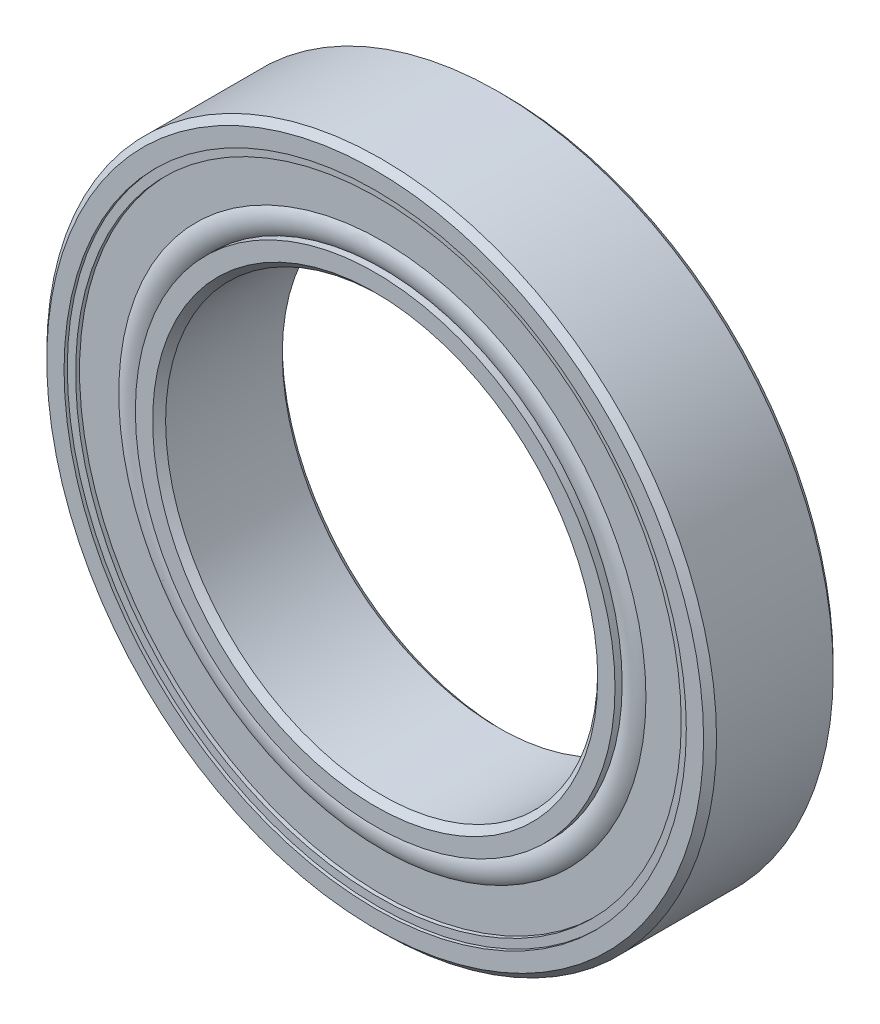
ISO-10303-21;
HEADER;
FILE_DESCRIPTION(('STEP AP214'),'2;1');
FILE_NAME('part.step','',(''),(''),'','','');
FILE_SCHEMA(('AUTOMOTIVE_DESIGN { 1 0 10303 214 1 1 1 1 }'));
ENDSEC;
DATA;
#1=APPLICATION_CONTEXT('core data for automotive mechanical design processes');
#2=APPLICATION_PROTOCOL_DEFINITION('international standard','automotive_design',2000,#1);
#3=PRODUCT_CONTEXT('',#1,'mechanical');
#4=PRODUCT('Part','Part','',(#3));
#5=PRODUCT_RELATED_PRODUCT_CATEGORY('part','',(#4));
#6=PRODUCT_DEFINITION_FORMATION('','',#4);
#7=PRODUCT_DEFINITION_CONTEXT('part definition',#1,'design');
#8=PRODUCT_DEFINITION('design','',#6,#7);
#9=PRODUCT_DEFINITION_SHAPE('','',#8);
#10=(LENGTH_UNIT() NAMED_UNIT(*) SI_UNIT(.MILLI.,.METRE.));
#11=(NAMED_UNIT(*) PLANE_ANGLE_UNIT() SI_UNIT($,.RADIAN.));
#12=(NAMED_UNIT(*) SI_UNIT($,.STERADIAN.) SOLID_ANGLE_UNIT());
#13=UNCERTAINTY_MEASURE_WITH_UNIT(LENGTH_MEASURE(1.E-05),#10,'distance_accuracy_value','');
#14=(GEOMETRIC_REPRESENTATION_CONTEXT(3) GLOBAL_UNCERTAINTY_ASSIGNED_CONTEXT((#13)) GLOBAL_UNIT_ASSIGNED_CONTEXT((#10,
#11,#12)) REPRESENTATION_CONTEXT('',''));
#15=CARTESIAN_POINT('',(0.,0.,0.));
#16=DIRECTION('',(0.,0.,1.));
#17=DIRECTION('',(1.,0.,0.));
#18=AXIS2_PLACEMENT_3D('',#15,#16,#17);
#19=CARTESIAN_POINT('',(0.,0.,-3.8571595971106));
#20=DIRECTION('',(0.,0.,1.));
#21=DIRECTION('',(1.,0.,0.));
#22=AXIS2_PLACEMENT_3D('',#19,#20,#21);
#23=TOROIDAL_SURFACE('',#22,23.29975,1.8428404028894);
#24=CARTESIAN_POINT('',(0.,0.,-5.3356929076997));
#25=DIRECTION('',(0.,0.,1.));
#26=DIRECTION('',(1.,0.,0.));
#27=AXIS2_PLACEMENT_3D('',#24,#25,#26);
#28=CIRCLE('',#27,24.39975);
#29=CARTESIAN_POINT('',(24.39975,0.,-5.3356929076997));
#30=VERTEX_POINT('',#29);
#31=EDGE_CURVE('E11',#30,#30,#28,.T.);
#32=ORIENTED_EDGE('',*,*,#31,.F.);
#33=EDGE_LOOP('',(#32));
#34=FACE_BOUND('',#33,.T.);
#35=CARTESIAN_POINT('',(0.,0.,-5.3356929076997));
#36=DIRECTION('',(0.,0.,1.));
#37=DIRECTION('',(1.,0.,0.));
#38=AXIS2_PLACEMENT_3D('',#35,#36,#37);
#39=CIRCLE('',#38,22.19975);
#40=CARTESIAN_POINT('',(22.19975,0.,-5.3356929076997));
#41=VERTEX_POINT('',#40);
#42=EDGE_CURVE('E73',#41,#41,#39,.T.);
#43=ORIENTED_EDGE('',*,*,#42,.T.);
#44=EDGE_LOOP('',(#43));
#45=FACE_BOUND('',#44,.T.);
#46=ADVANCED_FACE('F48',(#34,#45),#23,.T.);
#47=CARTESIAN_POINT('',(0.,28.02975,-5.3356929076997));
#48=DIRECTION('',(0.,0.,1.));
#49=DIRECTION('',(1.,0.,0.));
#50=AXIS2_PLACEMENT_3D('',#47,#48,#49);
#51=PLANE('',#50);
#52=CARTESIAN_POINT('',(0.,0.,-5.3356929076997));
#53=DIRECTION('',(0.,0.,1.));
#54=DIRECTION('',(1.,0.,0.));
#55=AXIS2_PLACEMENT_3D('',#52,#53,#54);
#56=CIRCLE('',#55,28.02975);
#57=CARTESIAN_POINT('',(28.02975,0.,-5.3356929076997));
#58=VERTEX_POINT('',#57);
#59=EDGE_CURVE('E54',#58,#58,#56,.T.);
#60=ORIENTED_EDGE('',*,*,#59,.F.);
#61=EDGE_LOOP('',(#60));
#62=FACE_BOUND('',#61,.T.);
#63=ORIENTED_EDGE('',*,*,#31,.T.);
#64=EDGE_LOOP('',(#63));
#65=FACE_BOUND('',#64,.T.);
#66=ADVANCED_FACE('F104',(#62,#65),#51,.F.);
#67=CARTESIAN_POINT('',(0.,0.,6.));
#68=DIRECTION('',(0.,0.,1.));
#69=DIRECTION('',(1.,0.,0.));
#70=AXIS2_PLACEMENT_3D('',#67,#68,#69);
#71=CYLINDRICAL_SURFACE('',#70,28.02975);
#72=CARTESIAN_POINT('',(0.,0.,-5.7));
#73=DIRECTION('',(0.,0.,1.));
#74=DIRECTION('',(1.,0.,0.));
#75=AXIS2_PLACEMENT_3D('',#72,#73,#74);
#76=CIRCLE('',#75,28.02975);
#77=CARTESIAN_POINT('',(28.02975,0.,-5.7));
#78=VERTEX_POINT('',#77);
#79=EDGE_CURVE('E58',#78,#78,#76,.T.);
#80=ORIENTED_EDGE('',*,*,#79,.F.);
#81=EDGE_LOOP('',(#80));
#82=FACE_BOUND('',#81,.T.);
#83=ORIENTED_EDGE('',*,*,#59,.T.);
#84=EDGE_LOOP('',(#83));
#85=FACE_BOUND('',#84,.T.);
#86=ADVANCED_FACE('F99',(#82,#85),#71,.F.);
#87=CARTESIAN_POINT('',(0.,28.79975,-5.7));
#88=DIRECTION('',(0.,0.,1.));
#89=DIRECTION('',(1.,0.,0.));
#90=AXIS2_PLACEMENT_3D('',#87,#88,#89);
#91=PLANE('',#90);
#92=CARTESIAN_POINT('',(0.,0.,-5.7));
#93=DIRECTION('',(0.,0.,1.));
#94=DIRECTION('',(1.,0.,0.));
#95=AXIS2_PLACEMENT_3D('',#92,#93,#94);
#96=CIRCLE('',#95,28.79975);
#97=CARTESIAN_POINT('',(28.79975,0.,-5.7));
#98=VERTEX_POINT('',#97);
#99=EDGE_CURVE('E62',#98,#98,#96,.T.);
#100=ORIENTED_EDGE('',*,*,#99,.F.);
#101=EDGE_LOOP('',(#100));
#102=FACE_BOUND('',#101,.T.);
#103=ORIENTED_EDGE('',*,*,#79,.T.);
#104=EDGE_LOOP('',(#103));
#105=FACE_BOUND('',#104,.T.);
#106=ADVANCED_FACE('F93',(#102,#105),#91,.F.);
#107=CARTESIAN_POINT('',(0.,0.,6.));
#108=DIRECTION('',(0.,0.,1.));
#109=DIRECTION('',(1.,0.,0.));
#110=AXIS2_PLACEMENT_3D('',#107,#108,#109);
#111=CYLINDRICAL_SURFACE('',#110,28.79975);
#112=CARTESIAN_POINT('',(0.,0.,-4.24277163079879));
#113=DIRECTION('',(0.,0.,1.));
#114=DIRECTION('',(1.,0.,0.));
#115=AXIS2_PLACEMENT_3D('',#112,#113,#114);
#116=CIRCLE('',#115,28.79975);
#117=CARTESIAN_POINT('',(28.79975,0.,-4.24277163079879));
#118=VERTEX_POINT('',#117);
#119=EDGE_CURVE('E67',#118,#118,#116,.T.);
#120=ORIENTED_EDGE('',*,*,#119,.F.);
#121=EDGE_LOOP('',(#120));
#122=FACE_BOUND('',#121,.T.);
#123=ORIENTED_EDGE('',*,*,#99,.T.);
#124=EDGE_LOOP('',(#123));
#125=FACE_BOUND('',#124,.T.);
#126=ADVANCED_FACE('F87',(#122,#125),#111,.T.);
#127=CARTESIAN_POINT('',(0.,28.79975,-4.24277163079879));
#128=DIRECTION('',(0.,0.,-1.));
#129=DIRECTION('',(-1.,0.,0.));
#130=AXIS2_PLACEMENT_3D('',#127,#128,#129);
#131=PLANE('',#130);
#132=CARTESIAN_POINT('',(0.,0.,-4.2427716307988));
#133=DIRECTION('',(0.,0.,1.));
#134=DIRECTION('',(1.,0.,0.));
#135=AXIS2_PLACEMENT_3D('',#132,#133,#134);
#136=CIRCLE('',#135,22.19975);
#137=CARTESIAN_POINT('',(22.19975,0.,-4.2427716307988));
#138=VERTEX_POINT('',#137);
#139=EDGE_CURVE('E70',#138,#138,#136,.T.);
#140=ORIENTED_EDGE('',*,*,#139,.F.);
#141=EDGE_LOOP('',(#140));
#142=FACE_BOUND('',#141,.T.);
#143=ORIENTED_EDGE('',*,*,#119,.T.);
#144=EDGE_LOOP('',(#143));
#145=FACE_BOUND('',#144,.T.);
#146=ADVANCED_FACE('F81',(#142,#145),#131,.F.);
#147=CARTESIAN_POINT('',(0.,0.,6.));
#148=DIRECTION('',(0.,0.,1.));
#149=DIRECTION('',(1.,0.,0.));
#150=AXIS2_PLACEMENT_3D('',#147,#148,#149);
#151=CYLINDRICAL_SURFACE('',#150,22.19975);
#152=ORIENTED_EDGE('',*,*,#42,.F.);
#153=EDGE_LOOP('',(#152));
#154=FACE_BOUND('',#153,.T.);
#155=ORIENTED_EDGE('',*,*,#139,.T.);
#156=EDGE_LOOP('',(#155));
#157=FACE_BOUND('',#156,.T.);
#158=ADVANCED_FACE('F78',(#154,#157),#151,.F.);
#159=CLOSED_SHELL('',(#46,#66,#86,#106,#126,#146,#158));
#160=MANIFOLD_SOLID_BREP('B2',#159);
#161=CARTESIAN_POINT('',(0.,28.79975,5.7));
#162=DIRECTION('',(0.,0.,-1.));
#163=DIRECTION('',(-1.,0.,0.));
#164=AXIS2_PLACEMENT_3D('',#161,#162,#163);
#165=PLANE('',#164);
#166=CARTESIAN_POINT('',(0.,0.,5.7));
#167=DIRECTION('',(0.,0.,1.));
#168=DIRECTION('',(1.,0.,0.));
#169=AXIS2_PLACEMENT_3D('',#166,#167,#168);
#170=CIRCLE('',#169,28.02975);
#171=CARTESIAN_POINT('',(28.02975,0.,5.7));
#172=VERTEX_POINT('',#171);
#173=EDGE_CURVE('E172',#172,#172,#170,.T.);
#174=ORIENTED_EDGE('',*,*,#173,.F.);
#175=EDGE_LOOP('',(#174));
#176=FACE_BOUND('',#175,.T.);
#177=CARTESIAN_POINT('',(0.,0.,5.7));
#178=DIRECTION('',(0.,0.,1.));
#179=DIRECTION('',(1.,0.,0.));
#180=AXIS2_PLACEMENT_3D('',#177,#178,#179);
#181=CIRCLE('',#180,28.79975);
#182=CARTESIAN_POINT('',(28.79975,0.,5.7));
#183=VERTEX_POINT('',#182);
#184=EDGE_CURVE('E47',#183,#183,#181,.T.);
#185=ORIENTED_EDGE('',*,*,#184,.T.);
#186=EDGE_LOOP('',(#185));
#187=FACE_BOUND('',#186,.T.);
#188=ADVANCED_FACE('F147',(#176,#187),#165,.F.);
#189=CARTESIAN_POINT('',(0.,0.,6.));
#190=DIRECTION('',(0.,0.,1.));
#191=DIRECTION('',(1.,0.,0.));
#192=AXIS2_PLACEMENT_3D('',#189,#190,#191);
#193=CYLINDRICAL_SURFACE('',#192,28.79975);
#194=ORIENTED_EDGE('',*,*,#184,.F.);
#195=EDGE_LOOP('',(#194));
#196=FACE_BOUND('',#195,.T.);
#197=CARTESIAN_POINT('',(0.,0.,4.2427716307988));
#198=DIRECTION('',(0.,0.,1.));
#199=DIRECTION('',(1.,0.,0.));
#200=AXIS2_PLACEMENT_3D('',#197,#198,#199);
#201=CIRCLE('',#200,28.79975);
#202=CARTESIAN_POINT('',(28.79975,0.,4.2427716307988));
#203=VERTEX_POINT('',#202);
#204=EDGE_CURVE('E153',#203,#203,#201,.T.);
#205=ORIENTED_EDGE('',*,*,#204,.T.);
#206=EDGE_LOOP('',(#205));
#207=FACE_BOUND('',#206,.T.);
#208=ADVANCED_FACE('F179',(#196,#207),#193,.T.);
#209=CARTESIAN_POINT('',(0.,28.79975,4.2427716307988));
#210=DIRECTION('',(0.,0.,1.));
#211=DIRECTION('',(1.,0.,0.));
#212=AXIS2_PLACEMENT_3D('',#209,#210,#211);
#213=PLANE('',#212);
#214=ORIENTED_EDGE('',*,*,#204,.F.);
#215=EDGE_LOOP('',(#214));
#216=FACE_BOUND('',#215,.T.);
#217=CARTESIAN_POINT('',(0.,0.,4.2427716307988));
#218=DIRECTION('',(0.,0.,1.));
#219=DIRECTION('',(1.,0.,0.));
#220=AXIS2_PLACEMENT_3D('',#217,#218,#219);
#221=CIRCLE('',#220,22.19975);
#222=CARTESIAN_POINT('',(22.19975,0.,4.2427716307988));
#223=VERTEX_POINT('',#222);
#224=EDGE_CURVE('E157',#223,#223,#221,.T.);
#225=ORIENTED_EDGE('',*,*,#224,.T.);
#226=EDGE_LOOP('',(#225));
#227=FACE_BOUND('',#226,.T.);
#228=ADVANCED_FACE('F183',(#216,#227),#213,.F.);
#229=CARTESIAN_POINT('',(0.,0.,6.));
#230=DIRECTION('',(0.,0.,1.));
#231=DIRECTION('',(1.,0.,0.));
#232=AXIS2_PLACEMENT_3D('',#229,#230,#231);
#233=CYLINDRICAL_SURFACE('',#232,22.19975);
#234=ORIENTED_EDGE('',*,*,#224,.F.);
#235=EDGE_LOOP('',(#234));
#236=FACE_BOUND('',#235,.T.);
#237=CARTESIAN_POINT('',(0.,0.,5.3356929076997));
#238=DIRECTION('',(0.,0.,1.));
#239=DIRECTION('',(1.,0.,0.));
#240=AXIS2_PLACEMENT_3D('',#237,#238,#239);
#241=CIRCLE('',#240,22.19975);
#242=CARTESIAN_POINT('',(22.19975,0.,5.3356929076997));
#243=VERTEX_POINT('',#242);
#244=EDGE_CURVE('E161',#243,#243,#241,.T.);
#245=ORIENTED_EDGE('',*,*,#244,.T.);
#246=EDGE_LOOP('',(#245));
#247=FACE_BOUND('',#246,.T.);
#248=ADVANCED_FACE('F188',(#236,#247),#233,.F.);
#249=CARTESIAN_POINT('',(0.,0.,3.8571595971106));
#250=DIRECTION('',(0.,0.,1.));
#251=DIRECTION('',(1.,0.,0.));
#252=AXIS2_PLACEMENT_3D('',#249,#250,#251);
#253=TOROIDAL_SURFACE('',#252,23.29975,1.8428404028894);
#254=ORIENTED_EDGE('',*,*,#244,.F.);
#255=EDGE_LOOP('',(#254));
#256=FACE_BOUND('',#255,.T.);
#257=CARTESIAN_POINT('',(0.,0.,5.3356929076997));
#258=DIRECTION('',(0.,0.,1.));
#259=DIRECTION('',(1.,0.,0.));
#260=AXIS2_PLACEMENT_3D('',#257,#258,#259);
#261=CIRCLE('',#260,24.39975);
#262=CARTESIAN_POINT('',(24.39975,0.,5.3356929076997));
#263=VERTEX_POINT('',#262);
#264=EDGE_CURVE('E166',#263,#263,#261,.T.);
#265=ORIENTED_EDGE('',*,*,#264,.T.);
#266=EDGE_LOOP('',(#265));
#267=FACE_BOUND('',#266,.T.);
#268=ADVANCED_FACE('F194',(#256,#267),#253,.T.);
#269=CARTESIAN_POINT('',(0.,28.02975,5.3356929076997));
#270=DIRECTION('',(0.,0.,-1.));
#271=DIRECTION('',(-1.,0.,0.));
#272=AXIS2_PLACEMENT_3D('',#269,#270,#271);
#273=PLANE('',#272);
#274=ORIENTED_EDGE('',*,*,#264,.F.);
#275=EDGE_LOOP('',(#274));
#276=FACE_BOUND('',#275,.T.);
#277=CARTESIAN_POINT('',(0.,0.,5.3356929076997));
#278=DIRECTION('',(0.,0.,1.));
#279=DIRECTION('',(1.,0.,0.));
#280=AXIS2_PLACEMENT_3D('',#277,#278,#279);
#281=CIRCLE('',#280,28.02975);
#282=CARTESIAN_POINT('',(28.02975,0.,5.3356929076997));
#283=VERTEX_POINT('',#282);
#284=EDGE_CURVE('E169',#283,#283,#281,.T.);
#285=ORIENTED_EDGE('',*,*,#284,.T.);
#286=EDGE_LOOP('',(#285));
#287=FACE_BOUND('',#286,.T.);
#288=ADVANCED_FACE('F198',(#276,#287),#273,.F.);
#289=CARTESIAN_POINT('',(0.,0.,6.));
#290=DIRECTION('',(0.,0.,1.));
#291=DIRECTION('',(1.,0.,0.));
#292=AXIS2_PLACEMENT_3D('',#289,#290,#291);
#293=CYLINDRICAL_SURFACE('',#292,28.02975);
#294=ORIENTED_EDGE('',*,*,#284,.F.);
#295=EDGE_LOOP('',(#294));
#296=FACE_BOUND('',#295,.T.);
#297=ORIENTED_EDGE('',*,*,#173,.T.);
#298=EDGE_LOOP('',(#297));
#299=FACE_BOUND('',#298,.T.);
#300=ADVANCED_FACE('F176',(#296,#299),#293,.F.);
#301=CLOSED_SHELL('',(#188,#208,#228,#248,#268,#288,#300));
#302=MANIFOLD_SOLID_BREP('B6',#301);
#303=CARTESIAN_POINT('',(-13.7862056849131,21.4517547738121,0.));
#304=DIRECTION('',(0.,0.,1.));
#305=DIRECTION('',(-0.540640817455586,0.841253532831188,0.));
#306=AXIS2_PLACEMENT_3D('',#303,#304,#305);
#307=SPHERICAL_SURFACE('',#306,4.2427716307988);
#308=CARTESIAN_POINT('',(-13.7862056849131,21.4517547738121,4.2427716307988));
#309=VERTEX_POINT('',#308);
#310=VERTEX_LOOP('',#309);
#311=FACE_BOUND('',#310,.T.);
#312=ADVANCED_FACE('F246',(#311),#307,.T.);
#313=CLOSED_SHELL('',(#312));
#314=MANIFOLD_SOLID_BREP('B42',#313);
#315=CARTESIAN_POINT('',(-23.1953884735413,10.5929789777951,0.));
#316=DIRECTION('',(0.,0.,1.));
#317=DIRECTION('',(-0.909631995354513,0.415415013001897,0.));
#318=AXIS2_PLACEMENT_3D('',#315,#316,#317);
#319=SPHERICAL_SURFACE('',#318,4.2427716307988);
#320=CARTESIAN_POINT('',(-23.1953884735413,10.5929789777951,4.2427716307988));
#321=VERTEX_POINT('',#320);
#322=VERTEX_LOOP('',#321);
#323=FACE_BOUND('',#322,.T.);
#324=ADVANCED_FACE('F263',(#323),#319,.T.);
#325=CLOSED_SHELL('',(#324));
#326=MANIFOLD_SOLID_BREP('B143',#325);
#327=CARTESIAN_POINT('',(-25.2401993126034,-3.62899279725894,0.));
#328=DIRECTION('',(0.,0.,1.));
#329=DIRECTION('',(-0.989821441880934,-0.142314838273275,0.));
#330=AXIS2_PLACEMENT_3D('',#327,#328,#329);
#331=SPHERICAL_SURFACE('',#330,4.2427716307988);
#332=CARTESIAN_POINT('',(-25.2401993126034,-3.62899279725894,4.2427716307988));
#333=VERTEX_POINT('',#332);
#334=VERTEX_LOOP('',#333);
#335=FACE_BOUND('',#334,.T.);
#336=ADVANCED_FACE('F280',(#335),#331,.T.);
#337=CLOSED_SHELL('',(#336));
#338=MANIFOLD_SOLID_BREP('B242',#337);
#339=CARTESIAN_POINT('',(-19.2714252086402,-16.6987850004211,0.));
#340=DIRECTION('',(0.,0.,1.));
#341=DIRECTION('',(-0.755749574354264,-0.654860733945278,0.));
#342=AXIS2_PLACEMENT_3D('',#339,#340,#341);
#343=SPHERICAL_SURFACE('',#342,4.2427716307988);
#344=CARTESIAN_POINT('',(-19.2714252086402,-16.6987850004211,4.2427716307988));
#345=VERTEX_POINT('',#344);
#346=VERTEX_LOOP('',#345);
#347=FACE_BOUND('',#346,.T.);
#348=ADVANCED_FACE('F297',(#347),#343,.T.);
#349=CLOSED_SHELL('',(#348));
#350=MANIFOLD_SOLID_BREP('B259',#349);
#351=CARTESIAN_POINT('',(-7.18410976631744,-24.4668309539262,0.));
#352=DIRECTION('',(0.,0.,1.));
#353=DIRECTION('',(-0.281732556841437,-0.959492973614495,0.));
#354=AXIS2_PLACEMENT_3D('',#351,#352,#353);
#355=SPHERICAL_SURFACE('',#354,4.2427716307988);
#356=CARTESIAN_POINT('',(-7.18410976631744,-24.4668309539262,4.2427716307988));
#357=VERTEX_POINT('',#356);
#358=VERTEX_LOOP('',#357);
#359=FACE_BOUND('',#358,.T.);
#360=ADVANCED_FACE('F314',(#359),#355,.T.);
#361=CLOSED_SHELL('',(#360));
#362=MANIFOLD_SOLID_BREP('B276',#361);
#363=CARTESIAN_POINT('',(7.18410976631708,-24.4668309539263,0.));
#364=DIRECTION('',(0.,0.,1.));
#365=DIRECTION('',(0.281732556841423,-0.959492973614499,0.));
#366=AXIS2_PLACEMENT_3D('',#363,#364,#365);
#367=SPHERICAL_SURFACE('',#366,4.2427716307988);
#368=CARTESIAN_POINT('',(7.18410976631708,-24.4668309539263,4.2427716307988));
#369=VERTEX_POINT('',#368);
#370=VERTEX_LOOP('',#369);
#371=FACE_BOUND('',#370,.T.);
#372=ADVANCED_FACE('F331',(#371),#367,.T.);
#373=CLOSED_SHELL('',(#372));
#374=MANIFOLD_SOLID_BREP('B293',#373);
#375=CARTESIAN_POINT('',(19.2714252086399,-16.6987850004214,0.));
#376=DIRECTION('',(0.,0.,1.));
#377=DIRECTION('',(0.755749574354255,-0.654860733945289,0.));
#378=AXIS2_PLACEMENT_3D('',#375,#376,#377);
#379=SPHERICAL_SURFACE('',#378,4.2427716307988);
#380=CARTESIAN_POINT('',(19.2714252086399,-16.6987850004214,4.2427716307988));
#381=VERTEX_POINT('',#380);
#382=VERTEX_LOOP('',#381);
#383=FACE_BOUND('',#382,.T.);
#384=ADVANCED_FACE('F348',(#383),#379,.T.);
#385=CLOSED_SHELL('',(#384));
#386=MANIFOLD_SOLID_BREP('B310',#385);
#387=CARTESIAN_POINT('',(25.2401993126033,-3.6289927972593,0.));
#388=DIRECTION('',(0.,0.,1.));
#389=DIRECTION('',(0.989821441880932,-0.142314838273289,0.));
#390=AXIS2_PLACEMENT_3D('',#387,#388,#389);
#391=SPHERICAL_SURFACE('',#390,4.2427716307988);
#392=CARTESIAN_POINT('',(25.2401993126033,-3.6289927972593,4.2427716307988));
#393=VERTEX_POINT('',#392);
#394=VERTEX_LOOP('',#393);
#395=FACE_BOUND('',#394,.T.);
#396=ADVANCED_FACE('F365',(#395),#391,.T.);
#397=CLOSED_SHELL('',(#396));
#398=MANIFOLD_SOLID_BREP('B327',#397);
#399=CARTESIAN_POINT('',(23.1953884735414,10.5929789777948,0.));
#400=DIRECTION('',(0.,0.,1.));
#401=DIRECTION('',(0.909631995354519,0.415415013001884,0.));
#402=AXIS2_PLACEMENT_3D('',#399,#400,#401);
#403=SPHERICAL_SURFACE('',#402,4.2427716307988);
#404=CARTESIAN_POINT('',(23.1953884735414,10.5929789777948,4.2427716307988));
#405=VERTEX_POINT('',#404);
#406=VERTEX_LOOP('',#405);
#407=FACE_BOUND('',#406,.T.);
#408=ADVANCED_FACE('F382',(#407),#403,.T.);
#409=CLOSED_SHELL('',(#408));
#410=MANIFOLD_SOLID_BREP('B344',#409);
#411=CARTESIAN_POINT('',(13.7862056849134,21.4517547738119,0.));
#412=DIRECTION('',(0.,0.,1.));
#413=DIRECTION('',(0.540640817455599,0.841253532831181,0.));
#414=AXIS2_PLACEMENT_3D('',#411,#412,#413);
#415=SPHERICAL_SURFACE('',#414,4.2427716307988);
#416=CARTESIAN_POINT('',(13.7862056849134,21.4517547738119,4.2427716307988));
#417=VERTEX_POINT('',#416);
#418=VERTEX_LOOP('',#417);
#419=FACE_BOUND('',#418,.T.);
#420=ADVANCED_FACE('F399',(#419),#415,.T.);
#421=CLOSED_SHELL('',(#420));
#422=MANIFOLD_SOLID_BREP('B361',#421);
#423=CARTESIAN_POINT('',(0.,25.49975,0.));
#424=DIRECTION('',(0.,0.,1.));
#425=DIRECTION('',(0.,1.,0.));
#426=AXIS2_PLACEMENT_3D('',#423,#424,#425);
#427=SPHERICAL_SURFACE('',#426,4.2427716307988);
#428=CARTESIAN_POINT('',(0.,25.49975,4.2427716307988));
#429=VERTEX_POINT('',#428);
#430=VERTEX_LOOP('',#429);
#431=FACE_BOUND('',#430,.T.);
#432=ADVANCED_FACE('F418',(#431),#427,.T.);
#433=CLOSED_SHELL('',(#432));
#434=MANIFOLD_SOLID_BREP('B378',#433);
#435=CARTESIAN_POINT('',(0.,0.,6.));
#436=DIRECTION('',(0.,0.,1.));
#437=DIRECTION('',(1.,0.,0.));
#438=AXIS2_PLACEMENT_3D('',#435,#436,#437);
#439=CONICAL_SURFACE('',#438,20.5995,0.785398163397454);
#440=CARTESIAN_POINT('',(0.,0.,5.4));
#441=DIRECTION('',(0.,0.,1.));
#442=DIRECTION('',(1.,0.,0.));
#443=AXIS2_PLACEMENT_3D('',#440,#441,#442);
#444=CIRCLE('',#443,19.9995);
#445=CARTESIAN_POINT('',(19.9995,0.,5.4));
#446=VERTEX_POINT('',#445);
#447=EDGE_CURVE('E417',#446,#446,#444,.T.);
#448=ORIENTED_EDGE('',*,*,#447,.F.);
#449=EDGE_LOOP('',(#448));
#450=FACE_BOUND('',#449,.T.);
#451=CARTESIAN_POINT('',(0.,0.,6.));
#452=DIRECTION('',(0.,0.,1.));
#453=DIRECTION('',(1.,0.,0.));
#454=AXIS2_PLACEMENT_3D('',#451,#452,#453);
#455=CIRCLE('',#454,20.5995);
#456=CARTESIAN_POINT('',(20.5995,0.,6.));
#457=VERTEX_POINT('',#456);
#458=EDGE_CURVE('E464',#457,#457,#455,.T.);
#459=ORIENTED_EDGE('',*,*,#458,.T.);
#460=EDGE_LOOP('',(#459));
#461=FACE_BOUND('',#460,.T.);
#462=ADVANCED_FACE('F436',(#450,#461),#439,.F.);
#463=CARTESIAN_POINT('',(0.,0.,6.));
#464=DIRECTION('',(0.,0.,1.));
#465=DIRECTION('',(1.,0.,0.));
#466=AXIS2_PLACEMENT_3D('',#463,#464,#465);
#467=CYLINDRICAL_SURFACE('',#466,19.9995);
#468=CARTESIAN_POINT('',(0.,0.,-5.4));
#469=DIRECTION('',(0.,0.,1.));
#470=DIRECTION('',(1.,0.,0.));
#471=AXIS2_PLACEMENT_3D('',#468,#469,#470);
#472=CIRCLE('',#471,19.9995);
#473=CARTESIAN_POINT('',(19.9995,0.,-5.4));
#474=VERTEX_POINT('',#473);
#475=EDGE_CURVE('E442',#474,#474,#472,.T.);
#476=ORIENTED_EDGE('',*,*,#475,.F.);
#477=EDGE_LOOP('',(#476));
#478=FACE_BOUND('',#477,.T.);
#479=ORIENTED_EDGE('',*,*,#447,.T.);
#480=EDGE_LOOP('',(#479));
#481=FACE_BOUND('',#480,.T.);
#482=ADVANCED_FACE('F501',(#478,#481),#467,.F.);
#483=CARTESIAN_POINT('',(0.,0.,-5.4));
#484=DIRECTION('',(0.,0.,-1.));
#485=DIRECTION('',(-1.,0.,0.));
#486=AXIS2_PLACEMENT_3D('',#483,#484,#485);
#487=CONICAL_SURFACE('',#486,19.9995,0.785398163397454);
#488=CARTESIAN_POINT('',(0.,0.,-6.));
#489=DIRECTION('',(0.,0.,1.));
#490=DIRECTION('',(1.,0.,0.));
#491=AXIS2_PLACEMENT_3D('',#488,#489,#490);
#492=CIRCLE('',#491,20.5995);
#493=CARTESIAN_POINT('',(20.5995,0.,-6.));
#494=VERTEX_POINT('',#493);
#495=EDGE_CURVE('E446',#494,#494,#492,.T.);
#496=ORIENTED_EDGE('',*,*,#495,.F.);
#497=EDGE_LOOP('',(#496));
#498=FACE_BOUND('',#497,.T.);
#499=ORIENTED_EDGE('',*,*,#475,.T.);
#500=EDGE_LOOP('',(#499));
#501=FACE_BOUND('',#500,.T.);
#502=ADVANCED_FACE('F496',(#498,#501),#487,.F.);
#503=CARTESIAN_POINT('',(0.,20.5995,-6.));
#504=DIRECTION('',(0.,0.,1.));
#505=DIRECTION('',(1.,0.,0.));
#506=AXIS2_PLACEMENT_3D('',#503,#504,#505);
#507=PLANE('',#506);
#508=CARTESIAN_POINT('',(0.,0.,-6.));
#509=DIRECTION('',(0.,0.,1.));
#510=DIRECTION('',(1.,0.,0.));
#511=AXIS2_PLACEMENT_3D('',#508,#509,#510);
#512=CIRCLE('',#511,22.19975);
#513=CARTESIAN_POINT('',(22.19975,0.,-6.));
#514=VERTEX_POINT('',#513);
#515=EDGE_CURVE('E450',#514,#514,#512,.T.);
#516=ORIENTED_EDGE('',*,*,#515,.F.);
#517=EDGE_LOOP('',(#516));
#518=FACE_BOUND('',#517,.T.);
#519=ORIENTED_EDGE('',*,*,#495,.T.);
#520=EDGE_LOOP('',(#519));
#521=FACE_BOUND('',#520,.T.);
#522=ADVANCED_FACE('F490',(#518,#521),#507,.F.);
#523=CARTESIAN_POINT('',(0.,0.,6.));
#524=DIRECTION('',(0.,0.,1.));
#525=DIRECTION('',(1.,0.,0.));
#526=AXIS2_PLACEMENT_3D('',#523,#524,#525);
#527=CYLINDRICAL_SURFACE('',#526,22.19975);
#528=CARTESIAN_POINT('',(0.,0.,-2.66666666666666));
#529=DIRECTION('',(0.,0.,1.));
#530=DIRECTION('',(1.,0.,0.));
#531=AXIS2_PLACEMENT_3D('',#528,#529,#530);
#532=CIRCLE('',#531,22.19975);
#533=CARTESIAN_POINT('',(22.19975,0.,-2.66666666666666));
#534=VERTEX_POINT('',#533);
#535=EDGE_CURVE('E455',#534,#534,#532,.T.);
#536=ORIENTED_EDGE('',*,*,#535,.F.);
#537=EDGE_LOOP('',(#536));
#538=FACE_BOUND('',#537,.T.);
#539=ORIENTED_EDGE('',*,*,#515,.T.);
#540=EDGE_LOOP('',(#539));
#541=FACE_BOUND('',#540,.T.);
#542=ADVANCED_FACE('F484',(#538,#541),#527,.T.);
#543=CARTESIAN_POINT('',(0.,0.,0.));
#544=DIRECTION('',(0.,0.,1.));
#545=DIRECTION('',(1.,0.,0.));
#546=AXIS2_PLACEMENT_3D('',#543,#544,#545);
#547=TOROIDAL_SURFACE('',#546,25.49975,4.2427716307988);
#548=CARTESIAN_POINT('',(0.,0.,2.66666666666667));
#549=DIRECTION('',(0.,0.,1.));
#550=DIRECTION('',(1.,0.,0.));
#551=AXIS2_PLACEMENT_3D('',#548,#549,#550);
#552=CIRCLE('',#551,22.19975);
#553=CARTESIAN_POINT('',(22.19975,0.,2.66666666666667));
#554=VERTEX_POINT('',#553);
#555=EDGE_CURVE('E458',#554,#554,#552,.T.);
#556=ORIENTED_EDGE('',*,*,#555,.F.);
#557=EDGE_LOOP('',(#556));
#558=FACE_BOUND('',#557,.T.);
#559=ORIENTED_EDGE('',*,*,#535,.T.);
#560=EDGE_LOOP('',(#559));
#561=FACE_BOUND('',#560,.T.);
#562=ADVANCED_FACE('F478',(#558,#561),#547,.F.);
#563=CARTESIAN_POINT('',(0.,0.,6.));
#564=DIRECTION('',(0.,0.,1.));
#565=DIRECTION('',(1.,0.,0.));
#566=AXIS2_PLACEMENT_3D('',#563,#564,#565);
#567=CYLINDRICAL_SURFACE('',#566,22.19975);
#568=CARTESIAN_POINT('',(0.,0.,6.));
#569=DIRECTION('',(0.,0.,1.));
#570=DIRECTION('',(1.,0.,0.));
#571=AXIS2_PLACEMENT_3D('',#568,#569,#570);
#572=CIRCLE('',#571,22.19975);
#573=CARTESIAN_POINT('',(22.19975,0.,6.));
#574=VERTEX_POINT('',#573);
#575=EDGE_CURVE('E461',#574,#574,#572,.T.);
#576=ORIENTED_EDGE('',*,*,#575,.F.);
#577=EDGE_LOOP('',(#576));
#578=FACE_BOUND('',#577,.T.);
#579=ORIENTED_EDGE('',*,*,#555,.T.);
#580=EDGE_LOOP('',(#579));
#581=FACE_BOUND('',#580,.T.);
#582=ADVANCED_FACE('F472',(#578,#581),#567,.T.);
#583=CARTESIAN_POINT('',(0.,20.5995,6.));
#584=DIRECTION('',(0.,0.,-1.));
#585=DIRECTION('',(-1.,0.,0.));
#586=AXIS2_PLACEMENT_3D('',#583,#584,#585);
#587=PLANE('',#586);
#588=ORIENTED_EDGE('',*,*,#458,.F.);
#589=EDGE_LOOP('',(#588));
#590=FACE_BOUND('',#589,.T.);
#591=ORIENTED_EDGE('',*,*,#575,.T.);
#592=EDGE_LOOP('',(#591));
#593=FACE_BOUND('',#592,.T.);
#594=ADVANCED_FACE('F469',(#590,#593),#587,.F.);
#595=CLOSED_SHELL('',(#462,#482,#502,#522,#542,#562,#582,#594));
#596=MANIFOLD_SOLID_BREP('B395',#595);
#597=CARTESIAN_POINT('',(0.,0.,5.4));
#598=DIRECTION('',(0.,0.,-1.));
#599=DIRECTION('',(-1.,0.,0.));
#600=AXIS2_PLACEMENT_3D('',#597,#598,#599);
#601=CONICAL_SURFACE('',#600,31.,0.785398163397445);
#602=CARTESIAN_POINT('',(0.,0.,6.));
#603=DIRECTION('',(0.,0.,1.));
#604=DIRECTION('',(1.,0.,0.));
#605=AXIS2_PLACEMENT_3D('',#602,#603,#604);
#606=CIRCLE('',#605,30.4);
#607=CARTESIAN_POINT('',(30.4,0.,6.));
#608=VERTEX_POINT('',#607);
#609=EDGE_CURVE('E435',#608,#608,#606,.T.);
#610=ORIENTED_EDGE('',*,*,#609,.F.);
#611=EDGE_LOOP('',(#610));
#612=FACE_BOUND('',#611,.T.);
#613=CARTESIAN_POINT('',(0.,0.,5.4));
#614=DIRECTION('',(0.,0.,1.));
#615=DIRECTION('',(1.,0.,0.));
#616=AXIS2_PLACEMENT_3D('',#613,#614,#615);
#617=CIRCLE('',#616,31.);
#618=CARTESIAN_POINT('',(31.,0.,5.4));
#619=VERTEX_POINT('',#618);
#620=EDGE_CURVE('E570',#619,#619,#617,.T.);
#621=ORIENTED_EDGE('',*,*,#620,.T.);
#622=EDGE_LOOP('',(#621));
#623=FACE_BOUND('',#622,.T.);
#624=ADVANCED_FACE('F542',(#612,#623),#601,.T.);
#625=CARTESIAN_POINT('',(0.,30.4,6.));
#626=DIRECTION('',(0.,0.,-1.));
#627=DIRECTION('',(-1.,0.,0.));
#628=AXIS2_PLACEMENT_3D('',#625,#626,#627);
#629=PLANE('',#628);
#630=CARTESIAN_POINT('',(0.,0.,6.));
#631=DIRECTION('',(0.,0.,1.));
#632=DIRECTION('',(1.,0.,0.));
#633=AXIS2_PLACEMENT_3D('',#630,#631,#632);
#634=CIRCLE('',#633,28.79975);
#635=CARTESIAN_POINT('',(28.79975,0.,6.));
#636=VERTEX_POINT('',#635);
#637=EDGE_CURVE('E548',#636,#636,#634,.T.);
#638=ORIENTED_EDGE('',*,*,#637,.F.);
#639=EDGE_LOOP('',(#638));
#640=FACE_BOUND('',#639,.T.);
#641=ORIENTED_EDGE('',*,*,#609,.T.);
#642=EDGE_LOOP('',(#641));
#643=FACE_BOUND('',#642,.T.);
#644=ADVANCED_FACE('F607',(#640,#643),#629,.F.);
#645=CARTESIAN_POINT('',(0.,0.,6.));
#646=DIRECTION('',(0.,0.,1.));
#647=DIRECTION('',(1.,0.,0.));
#648=AXIS2_PLACEMENT_3D('',#645,#646,#647);
#649=CYLINDRICAL_SURFACE('',#648,28.79975);
#650=CARTESIAN_POINT('',(0.,0.,2.66666666666667));
#651=DIRECTION('',(0.,0.,1.));
#652=DIRECTION('',(1.,0.,0.));
#653=AXIS2_PLACEMENT_3D('',#650,#651,#652);
#654=CIRCLE('',#653,28.79975);
#655=CARTESIAN_POINT('',(28.79975,0.,2.66666666666667));
#656=VERTEX_POINT('',#655);
#657=EDGE_CURVE('E552',#656,#656,#654,.T.);
#658=ORIENTED_EDGE('',*,*,#657,.F.);
#659=EDGE_LOOP('',(#658));
#660=FACE_BOUND('',#659,.T.);
#661=ORIENTED_EDGE('',*,*,#637,.T.);
#662=EDGE_LOOP('',(#661));
#663=FACE_BOUND('',#662,.T.);
#664=ADVANCED_FACE('F602',(#660,#663),#649,.F.);
#665=CARTESIAN_POINT('',(0.,0.,0.));
#666=DIRECTION('',(0.,0.,1.));
#667=DIRECTION('',(1.,0.,0.));
#668=AXIS2_PLACEMENT_3D('',#665,#666,#667);
#669=TOROIDAL_SURFACE('',#668,25.49975,4.2427716307988);
#670=CARTESIAN_POINT('',(0.,0.,-2.66666666666667));
#671=DIRECTION('',(0.,0.,1.));
#672=DIRECTION('',(1.,0.,0.));
#673=AXIS2_PLACEMENT_3D('',#670,#671,#672);
#674=CIRCLE('',#673,28.79975);
#675=CARTESIAN_POINT('',(28.79975,0.,-2.66666666666667));
#676=VERTEX_POINT('',#675);
#677=EDGE_CURVE('E556',#676,#676,#674,.T.);
#678=ORIENTED_EDGE('',*,*,#677,.F.);
#679=EDGE_LOOP('',(#678));
#680=FACE_BOUND('',#679,.T.);
#681=ORIENTED_EDGE('',*,*,#657,.T.);
#682=EDGE_LOOP('',(#681));
#683=FACE_BOUND('',#682,.T.);
#684=ADVANCED_FACE('F596',(#680,#683),#669,.F.);
#685=CARTESIAN_POINT('',(0.,0.,6.));
#686=DIRECTION('',(0.,0.,1.));
#687=DIRECTION('',(1.,0.,0.));
#688=AXIS2_PLACEMENT_3D('',#685,#686,#687);
#689=CYLINDRICAL_SURFACE('',#688,28.79975);
#690=CARTESIAN_POINT('',(0.,0.,-6.));
#691=DIRECTION('',(0.,0.,1.));
#692=DIRECTION('',(1.,0.,0.));
#693=AXIS2_PLACEMENT_3D('',#690,#691,#692);
#694=CIRCLE('',#693,28.79975);
#695=CARTESIAN_POINT('',(28.79975,0.,-6.));
#696=VERTEX_POINT('',#695);
#697=EDGE_CURVE('E561',#696,#696,#694,.T.);
#698=ORIENTED_EDGE('',*,*,#697,.F.);
#699=EDGE_LOOP('',(#698));
#700=FACE_BOUND('',#699,.T.);
#701=ORIENTED_EDGE('',*,*,#677,.T.);
#702=EDGE_LOOP('',(#701));
#703=FACE_BOUND('',#702,.T.);
#704=ADVANCED_FACE('F590',(#700,#703),#689,.F.);
#705=CARTESIAN_POINT('',(0.,30.4,-6.));
#706=DIRECTION('',(0.,0.,1.));
#707=DIRECTION('',(1.,0.,0.));
#708=AXIS2_PLACEMENT_3D('',#705,#706,#707);
#709=PLANE('',#708);
#710=CARTESIAN_POINT('',(0.,0.,-6.));
#711=DIRECTION('',(0.,0.,1.));
#712=DIRECTION('',(1.,0.,0.));
#713=AXIS2_PLACEMENT_3D('',#710,#711,#712);
#714=CIRCLE('',#713,30.4);
#715=CARTESIAN_POINT('',(30.4,0.,-6.));
#716=VERTEX_POINT('',#715);
#717=EDGE_CURVE('E564',#716,#716,#714,.T.);
#718=ORIENTED_EDGE('',*,*,#717,.F.);
#719=EDGE_LOOP('',(#718));
#720=FACE_BOUND('',#719,.T.);
#721=ORIENTED_EDGE('',*,*,#697,.T.);
#722=EDGE_LOOP('',(#721));
#723=FACE_BOUND('',#722,.T.);
#724=ADVANCED_FACE('F584',(#720,#723),#709,.F.);
#725=CARTESIAN_POINT('',(0.,0.,-6.));
#726=DIRECTION('',(0.,0.,1.));
#727=DIRECTION('',(1.,0.,0.));
#728=AXIS2_PLACEMENT_3D('',#725,#726,#727);
#729=CONICAL_SURFACE('',#728,30.4,0.78539816339745);
#730=CARTESIAN_POINT('',(0.,0.,-5.4));
#731=DIRECTION('',(0.,0.,1.));
#732=DIRECTION('',(1.,0.,0.));
#733=AXIS2_PLACEMENT_3D('',#730,#731,#732);
#734=CIRCLE('',#733,31.);
#735=CARTESIAN_POINT('',(31.,0.,-5.4));
#736=VERTEX_POINT('',#735);
#737=EDGE_CURVE('E567',#736,#736,#734,.T.);
#738=ORIENTED_EDGE('',*,*,#737,.F.);
#739=EDGE_LOOP('',(#738));
#740=FACE_BOUND('',#739,.T.);
#741=ORIENTED_EDGE('',*,*,#717,.T.);
#742=EDGE_LOOP('',(#741));
#743=FACE_BOUND('',#742,.T.);
#744=ADVANCED_FACE('F578',(#740,#743),#729,.T.);
#745=CARTESIAN_POINT('',(0.,0.,6.));
#746=DIRECTION('',(0.,0.,1.));
#747=DIRECTION('',(1.,0.,0.));
#748=AXIS2_PLACEMENT_3D('',#745,#746,#747);
#749=CYLINDRICAL_SURFACE('',#748,31.);
#750=ORIENTED_EDGE('',*,*,#620,.F.);
#751=EDGE_LOOP('',(#750));
#752=FACE_BOUND('',#751,.T.);
#753=ORIENTED_EDGE('',*,*,#737,.T.);
#754=EDGE_LOOP('',(#753));
#755=FACE_BOUND('',#754,.T.);
#756=ADVANCED_FACE('F575',(#752,#755),#749,.T.);
#757=CLOSED_SHELL('',(#624,#644,#664,#684,#704,#724,#744,#756));
#758=MANIFOLD_SOLID_BREP('B412',#757);
#759=ADVANCED_BREP_SHAPE_REPRESENTATION('',(#18,#160,#302,#314,#326,#338,#350,#362,#374,#386,
#398,#410,#422,#434,#596,#758),#14);
#760=SHAPE_DEFINITION_REPRESENTATION(#9,#759);
ENDSEC;
END-ISO-10303-21;
